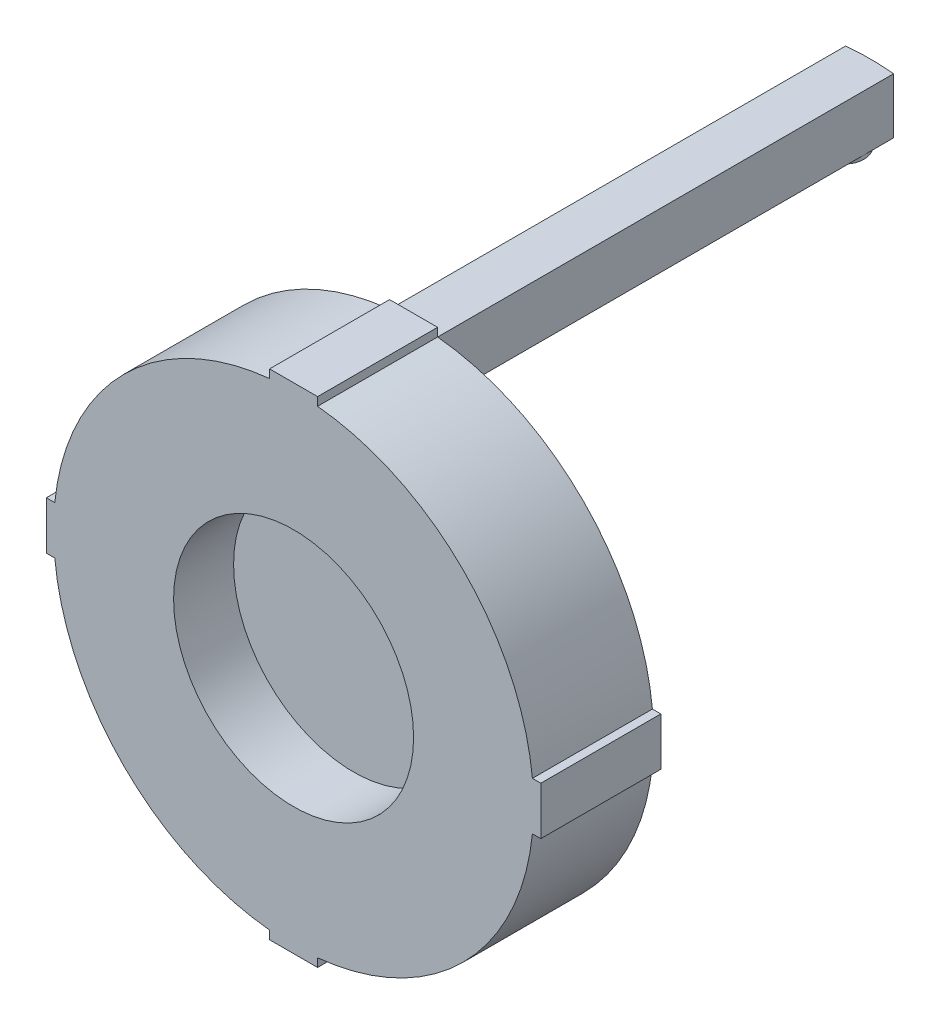
ISO-10303-21;
HEADER;
FILE_DESCRIPTION(('STEP AP214'),'2;1');
FILE_NAME('part.step','',(''),(''),'','','');
FILE_SCHEMA(('AUTOMOTIVE_DESIGN { 1 0 10303 214 1 1 1 1 }'));
ENDSEC;
DATA;
#1=APPLICATION_CONTEXT('core data for automotive mechanical design processes');
#2=APPLICATION_PROTOCOL_DEFINITION('international standard','automotive_design',2000,#1);
#3=PRODUCT_CONTEXT('',#1,'mechanical');
#4=PRODUCT('Part','Part','',(#3));
#5=PRODUCT_RELATED_PRODUCT_CATEGORY('part','',(#4));
#6=PRODUCT_DEFINITION_FORMATION('','',#4);
#7=PRODUCT_DEFINITION_CONTEXT('part definition',#1,'design');
#8=PRODUCT_DEFINITION('design','',#6,#7);
#9=PRODUCT_DEFINITION_SHAPE('','',#8);
#10=(LENGTH_UNIT() NAMED_UNIT(*) SI_UNIT(.MILLI.,.METRE.));
#11=(NAMED_UNIT(*) PLANE_ANGLE_UNIT() SI_UNIT($,.RADIAN.));
#12=(NAMED_UNIT(*) SI_UNIT($,.STERADIAN.) SOLID_ANGLE_UNIT());
#13=UNCERTAINTY_MEASURE_WITH_UNIT(LENGTH_MEASURE(1.E-05),#10,'distance_accuracy_value','');
#14=(GEOMETRIC_REPRESENTATION_CONTEXT(3) GLOBAL_UNCERTAINTY_ASSIGNED_CONTEXT((#13)) GLOBAL_UNIT_ASSIGNED_CONTEXT((#10,
#11,#12)) REPRESENTATION_CONTEXT('',''));
#15=CARTESIAN_POINT('',(0.,0.,0.));
#16=DIRECTION('',(0.,0.,1.));
#17=DIRECTION('',(1.,0.,0.));
#18=AXIS2_PLACEMENT_3D('',#15,#16,#17);
#19=CARTESIAN_POINT('',(0.500000000000018,5.15,0.));
#20=DIRECTION('',(1.,0.,0.));
#21=DIRECTION('',(0.,1.,0.));
#22=AXIS2_PLACEMENT_3D('',#19,#20,#21);
#23=PLANE('',#22);
#24=DIRECTION('',(0.,0.,-1.));
#25=VECTOR('',#24,1.);
#26=CARTESIAN_POINT('',(0.500000000000017,4.9749371855331,2.5));
#27=LINE('',#26,#25);
#28=CARTESIAN_POINT('',(0.500000000000017,4.9749371855331,0.));
#29=VERTEX_POINT('',#28);
#30=CARTESIAN_POINT('',(0.500000000000017,4.9749371855331,2.5));
#31=VERTEX_POINT('',#30);
#32=EDGE_CURVE('E217',#29,#31,#27,.F.);
#33=ORIENTED_EDGE('',*,*,#32,.F.);
#34=DIRECTION('',(0.,1.,0.));
#35=VECTOR('',#34,1.);
#36=CARTESIAN_POINT('',(0.500000000000018,5.15,0.));
#37=LINE('',#36,#35);
#38=CARTESIAN_POINT('',(0.500000000000018,5.15,0.));
#39=VERTEX_POINT('',#38);
#40=EDGE_CURVE('E186',#29,#39,#37,.T.);
#41=ORIENTED_EDGE('',*,*,#40,.T.);
#42=DIRECTION('',(0.,0.,1.));
#43=VECTOR('',#42,1.);
#44=CARTESIAN_POINT('',(0.500000000000018,5.15,0.));
#45=LINE('',#44,#43);
#46=CARTESIAN_POINT('',(0.500000000000018,5.15,2.5));
#47=VERTEX_POINT('',#46);
#48=EDGE_CURVE('E218',#39,#47,#45,.T.);
#49=ORIENTED_EDGE('',*,*,#48,.T.);
#50=DIRECTION('',(0.,1.,0.));
#51=VECTOR('',#50,1.);
#52=CARTESIAN_POINT('',(0.500000000000018,5.15,2.5));
#53=LINE('',#52,#51);
#54=EDGE_CURVE('E306',#31,#47,#53,.T.);
#55=ORIENTED_EDGE('',*,*,#54,.F.);
#56=EDGE_LOOP('',(#33,#41,#49,#55));
#57=FACE_BOUND('',#56,.T.);
#58=ADVANCED_FACE('F39',(#57),#23,.T.);
#59=CARTESIAN_POINT('',(-0.499999999999982,5.15,0.));
#60=DIRECTION('',(-1.,0.,0.));
#61=DIRECTION('',(0.,-1.,0.));
#62=AXIS2_PLACEMENT_3D('',#59,#60,#61);
#63=PLANE('',#62);
#64=DIRECTION('',(0.,0.,1.));
#65=VECTOR('',#64,1.);
#66=CARTESIAN_POINT('',(-0.499999999999982,5.15,0.));
#67=LINE('',#66,#65);
#68=CARTESIAN_POINT('',(-0.499999999999982,5.15,0.));
#69=VERTEX_POINT('',#68);
#70=CARTESIAN_POINT('',(-0.499999999999982,5.15,2.5));
#71=VERTEX_POINT('',#70);
#72=EDGE_CURVE('E197',#69,#71,#67,.T.);
#73=ORIENTED_EDGE('',*,*,#72,.F.);
#74=DIRECTION('',(0.,-1.,0.));
#75=VECTOR('',#74,1.);
#76=CARTESIAN_POINT('',(-0.499999999999982,5.15,0.));
#77=LINE('',#76,#75);
#78=CARTESIAN_POINT('',(-0.499999999999983,4.9749371855331,0.));
#79=VERTEX_POINT('',#78);
#80=EDGE_CURVE('E183',#69,#79,#77,.T.);
#81=ORIENTED_EDGE('',*,*,#80,.T.);
#82=DIRECTION('',(0.,0.,-1.));
#83=VECTOR('',#82,1.);
#84=CARTESIAN_POINT('',(-0.499999999999983,4.9749371855331,2.5));
#85=LINE('',#84,#83);
#86=CARTESIAN_POINT('',(-0.499999999999983,4.9749371855331,2.5));
#87=VERTEX_POINT('',#86);
#88=EDGE_CURVE('E195',#87,#79,#85,.T.);
#89=ORIENTED_EDGE('',*,*,#88,.F.);
#90=DIRECTION('',(0.,-1.,0.));
#91=VECTOR('',#90,1.);
#92=CARTESIAN_POINT('',(-0.499999999999982,5.15,2.5));
#93=LINE('',#92,#91);
#94=EDGE_CURVE('E303',#71,#87,#93,.T.);
#95=ORIENTED_EDGE('',*,*,#94,.F.);
#96=EDGE_LOOP('',(#73,#81,#89,#95));
#97=FACE_BOUND('',#96,.T.);
#98=ADVANCED_FACE('F192',(#97),#63,.T.);
#99=CARTESIAN_POINT('',(0.500000000000018,5.15,0.));
#100=DIRECTION('',(0.,1.,0.));
#101=DIRECTION('',(-1.,0.,0.));
#102=AXIS2_PLACEMENT_3D('',#99,#100,#101);
#103=PLANE('',#102);
#104=ORIENTED_EDGE('',*,*,#48,.F.);
#105=DIRECTION('',(-1.,0.,0.));
#106=VECTOR('',#105,1.);
#107=CARTESIAN_POINT('',(0.500000000000018,5.15,0.));
#108=LINE('',#107,#106);
#109=EDGE_CURVE('E199',#39,#69,#108,.T.);
#110=ORIENTED_EDGE('',*,*,#109,.T.);
#111=ORIENTED_EDGE('',*,*,#72,.T.);
#112=DIRECTION('',(-1.,0.,0.));
#113=VECTOR('',#112,1.);
#114=CARTESIAN_POINT('',(0.500000000000018,5.15,2.5));
#115=LINE('',#114,#113);
#116=EDGE_CURVE('E267',#47,#71,#115,.T.);
#117=ORIENTED_EDGE('',*,*,#116,.F.);
#118=EDGE_LOOP('',(#104,#110,#111,#117));
#119=FACE_BOUND('',#118,.T.);
#120=ADVANCED_FACE('F452',(#119),#103,.T.);
#121=CARTESIAN_POINT('',(0.,0.,-9.5));
#122=DIRECTION('',(0.,0.,-1.));
#123=DIRECTION('',(-1.,0.,0.));
#124=AXIS2_PLACEMENT_3D('',#121,#122,#123);
#125=PLANE('',#124);
#126=CARTESIAN_POINT('',(0.,0.,-9.5));
#127=DIRECTION('',(0.,0.,-1.));
#128=DIRECTION('',(-1.,0.,0.));
#129=AXIS2_PLACEMENT_3D('',#126,#127,#128);
#130=CIRCLE('',#129,5.);
#131=CARTESIAN_POINT('',(0.500000000000017,4.9749371855331,-9.5));
#132=VERTEX_POINT('',#131);
#133=CARTESIAN_POINT('',(-0.499999999999982,4.9749371855331,-9.5));
#134=VERTEX_POINT('',#133);
#135=EDGE_CURVE('E11',#132,#134,#130,.F.);
#136=ORIENTED_EDGE('',*,*,#135,.F.);
#137=DIRECTION('',(0.,-1.,0.));
#138=VECTOR('',#137,1.);
#139=CARTESIAN_POINT('',(0.500000000000017,5.15,-9.5));
#140=LINE('',#139,#138);
#141=CARTESIAN_POINT('',(0.500000000000017,3.81739439932528,-9.5));
#142=VERTEX_POINT('',#141);
#143=EDGE_CURVE('E208',#132,#142,#140,.T.);
#144=ORIENTED_EDGE('',*,*,#143,.T.);
#145=CARTESIAN_POINT('',(0.,0.,-9.5));
#146=DIRECTION('',(0.,0.,-1.));
#147=DIRECTION('',(-1.,0.,0.));
#148=AXIS2_PLACEMENT_3D('',#145,#146,#147);
#149=CIRCLE('',#148,3.85);
#150=CARTESIAN_POINT('',(-0.499999999999982,3.81739439932528,-9.5));
#151=VERTEX_POINT('',#150);
#152=EDGE_CURVE('E353',#142,#151,#149,.F.);
#153=ORIENTED_EDGE('',*,*,#152,.T.);
#154=DIRECTION('',(0.,1.,0.));
#155=VECTOR('',#154,1.);
#156=CARTESIAN_POINT('',(-0.499999999999982,5.15,-9.5));
#157=LINE('',#156,#155);
#158=EDGE_CURVE('E390',#151,#134,#157,.T.);
#159=ORIENTED_EDGE('',*,*,#158,.T.);
#160=EDGE_LOOP('',(#136,#144,#153,#159));
#161=FACE_BOUND('',#160,.T.);
#162=ADVANCED_FACE('F455',(#161),#125,.T.);
#163=DIRECTION('',(0.,0.,1.));
#164=VECTOR('',#163,1.);
#165=CARTESIAN_POINT('',(0.500000000000017,4.9749371855331,-17.));
#166=LINE('',#165,#164);
#167=EDGE_CURVE('E54',#29,#132,#166,.F.);
#168=ORIENTED_EDGE('',*,*,#167,.F.);
#169=DIRECTION('',(0.,-1.,0.));
#170=VECTOR('',#169,1.);
#171=CARTESIAN_POINT('',(0.500000000000017,5.15,0.));
#172=LINE('',#171,#170);
#173=CARTESIAN_POINT('',(0.500000000000013,3.81739439932528,0.));
#174=VERTEX_POINT('',#173);
#175=EDGE_CURVE('E346',#29,#174,#172,.T.);
#176=ORIENTED_EDGE('',*,*,#175,.T.);
#177=DIRECTION('',(0.,0.,1.));
#178=VECTOR('',#177,1.);
#179=CARTESIAN_POINT('',(0.500000000000013,3.81739439932528,-14.));
#180=LINE('',#179,#178);
#181=EDGE_CURVE('E209',#174,#142,#180,.F.);
#182=ORIENTED_EDGE('',*,*,#181,.T.);
#183=ORIENTED_EDGE('',*,*,#143,.F.);
#184=EDGE_LOOP('',(#168,#176,#182,#183));
#185=FACE_BOUND('',#184,.T.);
#186=ADVANCED_FACE('F372',(#185),#23,.T.);
#187=DIRECTION('',(0.,0.,1.));
#188=VECTOR('',#187,1.);
#189=CARTESIAN_POINT('',(-0.499999999999983,4.9749371855331,-17.));
#190=LINE('',#189,#188);
#191=EDGE_CURVE('E170',#134,#79,#190,.T.);
#192=ORIENTED_EDGE('',*,*,#191,.F.);
#193=ORIENTED_EDGE('',*,*,#158,.F.);
#194=DIRECTION('',(0.,0.,1.));
#195=VECTOR('',#194,1.);
#196=CARTESIAN_POINT('',(-0.499999999999987,3.81739439932528,-14.));
#197=LINE('',#196,#195);
#198=CARTESIAN_POINT('',(-0.499999999999987,3.81739439932528,0.));
#199=VERTEX_POINT('',#198);
#200=EDGE_CURVE('E62',#151,#199,#197,.T.);
#201=ORIENTED_EDGE('',*,*,#200,.T.);
#202=DIRECTION('',(0.,1.,0.));
#203=VECTOR('',#202,1.);
#204=CARTESIAN_POINT('',(-0.499999999999982,5.15,0.));
#205=LINE('',#204,#203);
#206=EDGE_CURVE('E202',#199,#79,#205,.T.);
#207=ORIENTED_EDGE('',*,*,#206,.T.);
#208=EDGE_LOOP('',(#192,#193,#201,#207));
#209=FACE_BOUND('',#208,.T.);
#210=ADVANCED_FACE('F203',(#209),#63,.T.);
#211=CARTESIAN_POINT('',(0.,0.,0.));
#212=DIRECTION('',(0.,0.,1.));
#213=DIRECTION('',(1.,0.,0.));
#214=AXIS2_PLACEMENT_3D('',#211,#212,#213);
#215=PLANE('',#214);
#216=DIRECTION('',(1.,0.,0.));
#217=VECTOR('',#216,1.);
#218=CARTESIAN_POINT('',(5.15,-0.5,0.));
#219=LINE('',#218,#217);
#220=CARTESIAN_POINT('',(4.9749371855331,-0.5,0.));
#221=VERTEX_POINT('',#220);
#222=CARTESIAN_POINT('',(5.15,-0.5,0.));
#223=VERTEX_POINT('',#222);
#224=EDGE_CURVE('E263',#221,#223,#219,.T.);
#225=ORIENTED_EDGE('',*,*,#224,.F.);
#226=CARTESIAN_POINT('',(0.,0.,0.));
#227=DIRECTION('',(0.,0.,1.));
#228=DIRECTION('',(1.,0.,0.));
#229=AXIS2_PLACEMENT_3D('',#226,#227,#228);
#230=CIRCLE('',#229,5.);
#231=CARTESIAN_POINT('',(0.499999999999948,-4.9749371855331,0.));
#232=VERTEX_POINT('',#231);
#233=EDGE_CURVE('E233',#232,#221,#230,.T.);
#234=ORIENTED_EDGE('',*,*,#233,.F.);
#235=DIRECTION('',(0.,1.,0.));
#236=VECTOR('',#235,1.);
#237=CARTESIAN_POINT('',(0.499999999999946,-5.15000000000001,0.));
#238=LINE('',#237,#236);
#239=CARTESIAN_POINT('',(0.499999999999946,-5.15000000000001,0.));
#240=VERTEX_POINT('',#239);
#241=EDGE_CURVE('E406',#240,#232,#238,.T.);
#242=ORIENTED_EDGE('',*,*,#241,.F.);
#243=DIRECTION('',(1.,0.,0.));
#244=VECTOR('',#243,1.);
#245=CARTESIAN_POINT('',(-0.500000000000054,-5.15,0.));
#246=LINE('',#245,#244);
#247=CARTESIAN_POINT('',(-0.500000000000054,-5.15,0.));
#248=VERTEX_POINT('',#247);
#249=EDGE_CURVE('E402',#248,#240,#246,.T.);
#250=ORIENTED_EDGE('',*,*,#249,.F.);
#251=DIRECTION('',(0.,-1.,0.));
#252=VECTOR('',#251,1.);
#253=CARTESIAN_POINT('',(-0.500000000000054,-5.15,0.));
#254=LINE('',#253,#252);
#255=CARTESIAN_POINT('',(-0.500000000000052,-4.97493718553309,0.));
#256=VERTEX_POINT('',#255);
#257=EDGE_CURVE('E410',#256,#248,#254,.T.);
#258=ORIENTED_EDGE('',*,*,#257,.F.);
#259=CARTESIAN_POINT('',(-4.9749371855331,-0.5,0.));
#260=VERTEX_POINT('',#259);
#261=EDGE_CURVE('E229',#260,#256,#230,.T.);
#262=ORIENTED_EDGE('',*,*,#261,.F.);
#263=DIRECTION('',(1.,0.,0.));
#264=VECTOR('',#263,1.);
#265=CARTESIAN_POINT('',(-5.15,-0.5,0.));
#266=LINE('',#265,#264);
#267=CARTESIAN_POINT('',(-5.15,-0.5,0.));
#268=VERTEX_POINT('',#267);
#269=EDGE_CURVE('E322',#268,#260,#266,.T.);
#270=ORIENTED_EDGE('',*,*,#269,.F.);
#271=DIRECTION('',(0.,-1.,0.));
#272=VECTOR('',#271,1.);
#273=CARTESIAN_POINT('',(-5.15,0.5,0.));
#274=LINE('',#273,#272);
#275=CARTESIAN_POINT('',(-5.15,0.5,0.));
#276=VERTEX_POINT('',#275);
#277=EDGE_CURVE('E318',#276,#268,#274,.T.);
#278=ORIENTED_EDGE('',*,*,#277,.F.);
#279=DIRECTION('',(-1.,0.,0.));
#280=VECTOR('',#279,1.);
#281=CARTESIAN_POINT('',(-5.15,0.5,0.));
#282=LINE('',#281,#280);
#283=CARTESIAN_POINT('',(-4.9749371855331,0.5,0.));
#284=VERTEX_POINT('',#283);
#285=EDGE_CURVE('E224',#284,#276,#282,.T.);
#286=ORIENTED_EDGE('',*,*,#285,.F.);
#287=EDGE_CURVE('E213',#79,#284,#230,.T.);
#288=ORIENTED_EDGE('',*,*,#287,.F.);
#289=ORIENTED_EDGE('',*,*,#206,.F.);
#290=CARTESIAN_POINT('',(0.,0.,0.));
#291=DIRECTION('',(0.,0.,-1.));
#292=DIRECTION('',(-1.,0.,0.));
#293=AXIS2_PLACEMENT_3D('',#290,#291,#292);
#294=CIRCLE('',#293,3.85);
#295=EDGE_CURVE('E369',#199,#174,#294,.T.);
#296=ORIENTED_EDGE('',*,*,#295,.T.);
#297=ORIENTED_EDGE('',*,*,#175,.F.);
#298=CARTESIAN_POINT('',(4.9749371855331,0.5,0.));
#299=VERTEX_POINT('',#298);
#300=EDGE_CURVE('E226',#299,#29,#230,.T.);
#301=ORIENTED_EDGE('',*,*,#300,.F.);
#302=DIRECTION('',(-1.,0.,0.));
#303=VECTOR('',#302,1.);
#304=CARTESIAN_POINT('',(5.15,0.5,0.));
#305=LINE('',#304,#303);
#306=CARTESIAN_POINT('',(5.15,0.5,0.));
#307=VERTEX_POINT('',#306);
#308=EDGE_CURVE('E276',#307,#299,#305,.T.);
#309=ORIENTED_EDGE('',*,*,#308,.F.);
#310=DIRECTION('',(0.,1.,0.));
#311=VECTOR('',#310,1.);
#312=CARTESIAN_POINT('',(5.15,-0.5,0.));
#313=LINE('',#312,#311);
#314=EDGE_CURVE('E273',#223,#307,#313,.T.);
#315=ORIENTED_EDGE('',*,*,#314,.F.);
#316=EDGE_LOOP('',(#225,#234,#242,#250,#258,#262,#270,#278,#286,#288,#289,#296,#297,#301,#309,#315));
#317=FACE_BOUND('',#316,.T.);
#318=ADVANCED_FACE('F222',(#317),#215,.F.);
#319=CARTESIAN_POINT('',(0.,0.,2.5));
#320=DIRECTION('',(0.,0.,-1.));
#321=DIRECTION('',(-1.,0.,0.));
#322=AXIS2_PLACEMENT_3D('',#319,#320,#321);
#323=CYLINDRICAL_SURFACE('',#322,5.);
#324=ORIENTED_EDGE('',*,*,#261,.T.);
#325=DIRECTION('',(0.,0.,-1.));
#326=VECTOR('',#325,1.);
#327=CARTESIAN_POINT('',(-0.500000000000052,-4.97493718553309,2.5));
#328=LINE('',#327,#326);
#329=CARTESIAN_POINT('',(-0.500000000000052,-4.97493718553309,2.5));
#330=VERTEX_POINT('',#329);
#331=EDGE_CURVE('E290',#256,#330,#328,.F.);
#332=ORIENTED_EDGE('',*,*,#331,.T.);
#333=CARTESIAN_POINT('',(0.,0.,2.5));
#334=DIRECTION('',(0.,0.,1.));
#335=DIRECTION('',(1.,0.,0.));
#336=AXIS2_PLACEMENT_3D('',#333,#334,#335);
#337=CIRCLE('',#336,5.);
#338=CARTESIAN_POINT('',(-4.9749371855331,-0.5,2.5));
#339=VERTEX_POINT('',#338);
#340=EDGE_CURVE('E247',#339,#330,#337,.T.);
#341=ORIENTED_EDGE('',*,*,#340,.F.);
#342=DIRECTION('',(0.,0.,-1.));
#343=VECTOR('',#342,1.);
#344=CARTESIAN_POINT('',(-4.9749371855331,-0.5,2.5));
#345=LINE('',#344,#343);
#346=EDGE_CURVE('E234',#339,#260,#345,.T.);
#347=ORIENTED_EDGE('',*,*,#346,.T.);
#348=EDGE_LOOP('',(#324,#332,#341,#347));
#349=FACE_BOUND('',#348,.T.);
#350=ADVANCED_FACE('F508',(#349),#323,.T.);
#351=CARTESIAN_POINT('',(0.499999999999948,-4.9749371855331,2.5));
#352=VERTEX_POINT('',#351);
#353=CARTESIAN_POINT('',(4.9749371855331,-0.5,2.5));
#354=VERTEX_POINT('',#353);
#355=EDGE_CURVE('E347',#352,#354,#337,.T.);
#356=ORIENTED_EDGE('',*,*,#355,.F.);
#357=DIRECTION('',(0.,0.,-1.));
#358=VECTOR('',#357,1.);
#359=CARTESIAN_POINT('',(0.499999999999948,-4.9749371855331,2.5));
#360=LINE('',#359,#358);
#361=EDGE_CURVE('E257',#352,#232,#360,.T.);
#362=ORIENTED_EDGE('',*,*,#361,.T.);
#363=ORIENTED_EDGE('',*,*,#233,.T.);
#364=DIRECTION('',(0.,0.,-1.));
#365=VECTOR('',#364,1.);
#366=CARTESIAN_POINT('',(4.9749371855331,-0.5,2.5));
#367=LINE('',#366,#365);
#368=EDGE_CURVE('E255',#221,#354,#367,.F.);
#369=ORIENTED_EDGE('',*,*,#368,.T.);
#370=EDGE_LOOP('',(#356,#362,#363,#369));
#371=FACE_BOUND('',#370,.T.);
#372=ADVANCED_FACE('F254',(#371),#323,.T.);
#373=CARTESIAN_POINT('',(4.9749371855331,0.5,2.5));
#374=VERTEX_POINT('',#373);
#375=EDGE_CURVE('E246',#374,#31,#337,.T.);
#376=ORIENTED_EDGE('',*,*,#375,.F.);
#377=DIRECTION('',(0.,0.,-1.));
#378=VECTOR('',#377,1.);
#379=CARTESIAN_POINT('',(4.9749371855331,0.5,2.5));
#380=LINE('',#379,#378);
#381=EDGE_CURVE('E268',#374,#299,#380,.T.);
#382=ORIENTED_EDGE('',*,*,#381,.T.);
#383=ORIENTED_EDGE('',*,*,#300,.T.);
#384=ORIENTED_EDGE('',*,*,#32,.T.);
#385=EDGE_LOOP('',(#376,#382,#383,#384));
#386=FACE_BOUND('',#385,.T.);
#387=ADVANCED_FACE('F366',(#386),#323,.T.);
#388=CARTESIAN_POINT('',(-4.9749371855331,0.5,2.5));
#389=VERTEX_POINT('',#388);
#390=EDGE_CURVE('E215',#87,#389,#337,.T.);
#391=ORIENTED_EDGE('',*,*,#390,.F.);
#392=ORIENTED_EDGE('',*,*,#88,.T.);
#393=ORIENTED_EDGE('',*,*,#287,.T.);
#394=DIRECTION('',(0.,0.,-1.));
#395=VECTOR('',#394,1.);
#396=CARTESIAN_POINT('',(-4.9749371855331,0.5,2.5));
#397=LINE('',#396,#395);
#398=EDGE_CURVE('E227',#284,#389,#397,.F.);
#399=ORIENTED_EDGE('',*,*,#398,.T.);
#400=EDGE_LOOP('',(#391,#392,#393,#399));
#401=FACE_BOUND('',#400,.T.);
#402=ADVANCED_FACE('F41',(#401),#323,.T.);
#403=CARTESIAN_POINT('',(0.,0.,2.5));
#404=DIRECTION('',(0.,0.,1.));
#405=DIRECTION('',(1.,0.,0.));
#406=AXIS2_PLACEMENT_3D('',#403,#404,#405);
#407=PLANE('',#406);
#408=CARTESIAN_POINT('',(0.,0.,2.5));
#409=DIRECTION('',(0.,0.,1.));
#410=DIRECTION('',(1.,0.,0.));
#411=AXIS2_PLACEMENT_3D('',#408,#409,#410);
#412=CIRCLE('',#411,2.5);
#413=CARTESIAN_POINT('',(2.5,0.,2.5));
#414=VERTEX_POINT('',#413);
#415=EDGE_CURVE('E392',#414,#414,#412,.T.);
#416=ORIENTED_EDGE('',*,*,#415,.F.);
#417=EDGE_LOOP('',(#416));
#418=FACE_BOUND('',#417,.T.);
#419=ORIENTED_EDGE('',*,*,#340,.T.);
#420=DIRECTION('',(0.,-1.,0.));
#421=VECTOR('',#420,1.);
#422=CARTESIAN_POINT('',(-0.500000000000054,-5.15,2.5));
#423=LINE('',#422,#421);
#424=CARTESIAN_POINT('',(-0.500000000000054,-5.15,2.5));
#425=VERTEX_POINT('',#424);
#426=EDGE_CURVE('E407',#330,#425,#423,.T.);
#427=ORIENTED_EDGE('',*,*,#426,.T.);
#428=DIRECTION('',(1.,0.,0.));
#429=VECTOR('',#428,1.);
#430=CARTESIAN_POINT('',(-0.500000000000054,-5.15,2.5));
#431=LINE('',#430,#429);
#432=CARTESIAN_POINT('',(0.499999999999946,-5.15000000000001,2.5));
#433=VERTEX_POINT('',#432);
#434=EDGE_CURVE('E398',#425,#433,#431,.T.);
#435=ORIENTED_EDGE('',*,*,#434,.T.);
#436=DIRECTION('',(0.,1.,0.));
#437=VECTOR('',#436,1.);
#438=CARTESIAN_POINT('',(0.499999999999946,-5.15000000000001,2.5));
#439=LINE('',#438,#437);
#440=EDGE_CURVE('E417',#433,#352,#439,.T.);
#441=ORIENTED_EDGE('',*,*,#440,.T.);
#442=ORIENTED_EDGE('',*,*,#355,.T.);
#443=DIRECTION('',(1.,0.,0.));
#444=VECTOR('',#443,1.);
#445=CARTESIAN_POINT('',(5.15,-0.5,2.5));
#446=LINE('',#445,#444);
#447=CARTESIAN_POINT('',(5.15,-0.5,2.5));
#448=VERTEX_POINT('',#447);
#449=EDGE_CURVE('E265',#354,#448,#446,.T.);
#450=ORIENTED_EDGE('',*,*,#449,.T.);
#451=DIRECTION('',(0.,1.,0.));
#452=VECTOR('',#451,1.);
#453=CARTESIAN_POINT('',(5.15,-0.5,2.5));
#454=LINE('',#453,#452);
#455=CARTESIAN_POINT('',(5.15,0.5,2.5));
#456=VERTEX_POINT('',#455);
#457=EDGE_CURVE('E285',#448,#456,#454,.T.);
#458=ORIENTED_EDGE('',*,*,#457,.T.);
#459=DIRECTION('',(-1.,0.,0.));
#460=VECTOR('',#459,1.);
#461=CARTESIAN_POINT('',(5.15,0.5,2.5));
#462=LINE('',#461,#460);
#463=EDGE_CURVE('E289',#456,#374,#462,.T.);
#464=ORIENTED_EDGE('',*,*,#463,.T.);
#465=ORIENTED_EDGE('',*,*,#375,.T.);
#466=ORIENTED_EDGE('',*,*,#54,.T.);
#467=ORIENTED_EDGE('',*,*,#116,.T.);
#468=ORIENTED_EDGE('',*,*,#94,.T.);
#469=ORIENTED_EDGE('',*,*,#390,.T.);
#470=DIRECTION('',(-1.,0.,0.));
#471=VECTOR('',#470,1.);
#472=CARTESIAN_POINT('',(-5.15,0.5,2.5));
#473=LINE('',#472,#471);
#474=CARTESIAN_POINT('',(-5.15,0.5,2.5));
#475=VERTEX_POINT('',#474);
#476=EDGE_CURVE('E323',#389,#475,#473,.T.);
#477=ORIENTED_EDGE('',*,*,#476,.T.);
#478=DIRECTION('',(0.,-1.,0.));
#479=VECTOR('',#478,1.);
#480=CARTESIAN_POINT('',(-5.15,0.5,2.5));
#481=LINE('',#480,#479);
#482=CARTESIAN_POINT('',(-5.15,-0.5,2.5));
#483=VERTEX_POINT('',#482);
#484=EDGE_CURVE('E317',#475,#483,#481,.T.);
#485=ORIENTED_EDGE('',*,*,#484,.T.);
#486=DIRECTION('',(1.,0.,0.));
#487=VECTOR('',#486,1.);
#488=CARTESIAN_POINT('',(-5.15,-0.5,2.5));
#489=LINE('',#488,#487);
#490=EDGE_CURVE('E332',#483,#339,#489,.T.);
#491=ORIENTED_EDGE('',*,*,#490,.T.);
#492=EDGE_LOOP('',(#419,#427,#435,#441,#442,#450,#458,#464,#465,#466,#467,#468,#469,#477,#485,#491));
#493=FACE_BOUND('',#492,.T.);
#494=ADVANCED_FACE('F358',(#418,#493),#407,.T.);
#495=CARTESIAN_POINT('',(-5.15,0.5,0.));
#496=DIRECTION('',(0.,1.,0.));
#497=DIRECTION('',(0.,0.,1.));
#498=AXIS2_PLACEMENT_3D('',#495,#496,#497);
#499=PLANE('',#498);
#500=ORIENTED_EDGE('',*,*,#398,.F.);
#501=ORIENTED_EDGE('',*,*,#285,.T.);
#502=DIRECTION('',(0.,0.,1.));
#503=VECTOR('',#502,1.);
#504=CARTESIAN_POINT('',(-5.15,0.5,0.));
#505=LINE('',#504,#503);
#506=EDGE_CURVE('E337',#276,#475,#505,.T.);
#507=ORIENTED_EDGE('',*,*,#506,.T.);
#508=ORIENTED_EDGE('',*,*,#476,.F.);
#509=EDGE_LOOP('',(#500,#501,#507,#508));
#510=FACE_BOUND('',#509,.T.);
#511=ADVANCED_FACE('F506',(#510),#499,.T.);
#512=CARTESIAN_POINT('',(-5.15,-0.5,0.));
#513=DIRECTION('',(0.,-1.,0.));
#514=DIRECTION('',(0.,0.,-1.));
#515=AXIS2_PLACEMENT_3D('',#512,#513,#514);
#516=PLANE('',#515);
#517=ORIENTED_EDGE('',*,*,#346,.F.);
#518=ORIENTED_EDGE('',*,*,#490,.F.);
#519=DIRECTION('',(0.,0.,1.));
#520=VECTOR('',#519,1.);
#521=CARTESIAN_POINT('',(-5.15,-0.5,0.));
#522=LINE('',#521,#520);
#523=EDGE_CURVE('E328',#268,#483,#522,.T.);
#524=ORIENTED_EDGE('',*,*,#523,.F.);
#525=ORIENTED_EDGE('',*,*,#269,.T.);
#526=EDGE_LOOP('',(#517,#518,#524,#525));
#527=FACE_BOUND('',#526,.T.);
#528=ADVANCED_FACE('F507',(#527),#516,.T.);
#529=CARTESIAN_POINT('',(-5.15,0.5,0.));
#530=DIRECTION('',(-1.,0.,0.));
#531=DIRECTION('',(0.,0.,1.));
#532=AXIS2_PLACEMENT_3D('',#529,#530,#531);
#533=PLANE('',#532);
#534=ORIENTED_EDGE('',*,*,#484,.F.);
#535=ORIENTED_EDGE('',*,*,#506,.F.);
#536=ORIENTED_EDGE('',*,*,#277,.T.);
#537=ORIENTED_EDGE('',*,*,#523,.T.);
#538=EDGE_LOOP('',(#534,#535,#536,#537));
#539=FACE_BOUND('',#538,.T.);
#540=ADVANCED_FACE('F445',(#539),#533,.T.);
#541=CARTESIAN_POINT('',(5.15,-0.5,0.));
#542=DIRECTION('',(0.,-1.,0.));
#543=DIRECTION('',(0.,0.,-1.));
#544=AXIS2_PLACEMENT_3D('',#541,#542,#543);
#545=PLANE('',#544);
#546=ORIENTED_EDGE('',*,*,#368,.F.);
#547=ORIENTED_EDGE('',*,*,#224,.T.);
#548=DIRECTION('',(0.,0.,1.));
#549=VECTOR('',#548,1.);
#550=CARTESIAN_POINT('',(5.15,-0.5,0.));
#551=LINE('',#550,#549);
#552=EDGE_CURVE('E280',#223,#448,#551,.T.);
#553=ORIENTED_EDGE('',*,*,#552,.T.);
#554=ORIENTED_EDGE('',*,*,#449,.F.);
#555=EDGE_LOOP('',(#546,#547,#553,#554));
#556=FACE_BOUND('',#555,.T.);
#557=ADVANCED_FACE('F261',(#556),#545,.T.);
#558=CARTESIAN_POINT('',(5.15,0.5,0.));
#559=DIRECTION('',(0.,1.,0.));
#560=DIRECTION('',(0.,0.,1.));
#561=AXIS2_PLACEMENT_3D('',#558,#559,#560);
#562=PLANE('',#561);
#563=ORIENTED_EDGE('',*,*,#381,.F.);
#564=ORIENTED_EDGE('',*,*,#463,.F.);
#565=DIRECTION('',(0.,0.,1.));
#566=VECTOR('',#565,1.);
#567=CARTESIAN_POINT('',(5.15,0.5,0.));
#568=LINE('',#567,#566);
#569=EDGE_CURVE('E275',#307,#456,#568,.T.);
#570=ORIENTED_EDGE('',*,*,#569,.F.);
#571=ORIENTED_EDGE('',*,*,#308,.T.);
#572=EDGE_LOOP('',(#563,#564,#570,#571));
#573=FACE_BOUND('',#572,.T.);
#574=ADVANCED_FACE('F436',(#573),#562,.T.);
#575=CARTESIAN_POINT('',(5.15,-0.5,0.));
#576=DIRECTION('',(1.,0.,0.));
#577=DIRECTION('',(0.,0.,-1.));
#578=AXIS2_PLACEMENT_3D('',#575,#576,#577);
#579=PLANE('',#578);
#580=ORIENTED_EDGE('',*,*,#457,.F.);
#581=ORIENTED_EDGE('',*,*,#552,.F.);
#582=ORIENTED_EDGE('',*,*,#314,.T.);
#583=ORIENTED_EDGE('',*,*,#569,.T.);
#584=EDGE_LOOP('',(#580,#581,#582,#583));
#585=FACE_BOUND('',#584,.T.);
#586=ADVANCED_FACE('F434',(#585),#579,.T.);
#587=CARTESIAN_POINT('',(-0.500000000000054,-5.15,0.));
#588=DIRECTION('',(-1.,0.,0.));
#589=DIRECTION('',(0.,-1.,0.));
#590=AXIS2_PLACEMENT_3D('',#587,#588,#589);
#591=PLANE('',#590);
#592=ORIENTED_EDGE('',*,*,#331,.F.);
#593=ORIENTED_EDGE('',*,*,#257,.T.);
#594=DIRECTION('',(0.,0.,1.));
#595=VECTOR('',#594,1.);
#596=CARTESIAN_POINT('',(-0.500000000000054,-5.15,0.));
#597=LINE('',#596,#595);
#598=EDGE_CURVE('E422',#248,#425,#597,.T.);
#599=ORIENTED_EDGE('',*,*,#598,.T.);
#600=ORIENTED_EDGE('',*,*,#426,.F.);
#601=EDGE_LOOP('',(#592,#593,#599,#600));
#602=FACE_BOUND('',#601,.T.);
#603=ADVANCED_FACE('F443',(#602),#591,.T.);
#604=CARTESIAN_POINT('',(0.499999999999946,-5.15000000000001,0.));
#605=DIRECTION('',(1.,0.,0.));
#606=DIRECTION('',(0.,1.,0.));
#607=AXIS2_PLACEMENT_3D('',#604,#605,#606);
#608=PLANE('',#607);
#609=ORIENTED_EDGE('',*,*,#361,.F.);
#610=ORIENTED_EDGE('',*,*,#440,.F.);
#611=DIRECTION('',(0.,0.,1.));
#612=VECTOR('',#611,1.);
#613=CARTESIAN_POINT('',(0.499999999999946,-5.15000000000001,0.));
#614=LINE('',#613,#612);
#615=EDGE_CURVE('E413',#240,#433,#614,.T.);
#616=ORIENTED_EDGE('',*,*,#615,.F.);
#617=ORIENTED_EDGE('',*,*,#241,.T.);
#618=EDGE_LOOP('',(#609,#610,#616,#617));
#619=FACE_BOUND('',#618,.T.);
#620=ADVANCED_FACE('F483',(#619),#608,.T.);
#621=CARTESIAN_POINT('',(-0.500000000000054,-5.15,0.));
#622=DIRECTION('',(0.,-1.,0.));
#623=DIRECTION('',(1.,0.,0.));
#624=AXIS2_PLACEMENT_3D('',#621,#622,#623);
#625=PLANE('',#624);
#626=ORIENTED_EDGE('',*,*,#434,.F.);
#627=ORIENTED_EDGE('',*,*,#598,.F.);
#628=ORIENTED_EDGE('',*,*,#249,.T.);
#629=ORIENTED_EDGE('',*,*,#615,.T.);
#630=EDGE_LOOP('',(#626,#627,#628,#629));
#631=FACE_BOUND('',#630,.T.);
#632=ADVANCED_FACE('F479',(#631),#625,.T.);
#633=CARTESIAN_POINT('',(0.,0.,1.25));
#634=DIRECTION('',(0.,0.,1.));
#635=DIRECTION('',(1.,0.,0.));
#636=AXIS2_PLACEMENT_3D('',#633,#634,#635);
#637=CYLINDRICAL_SURFACE('',#636,2.5);
#638=CARTESIAN_POINT('',(0.,0.,1.25));
#639=DIRECTION('',(0.,0.,1.));
#640=DIRECTION('',(1.,0.,0.));
#641=AXIS2_PLACEMENT_3D('',#638,#639,#640);
#642=CIRCLE('',#641,2.5);
#643=CARTESIAN_POINT('',(2.5,0.,1.25));
#644=VERTEX_POINT('',#643);
#645=EDGE_CURVE('E394',#644,#644,#642,.T.);
#646=ORIENTED_EDGE('',*,*,#645,.F.);
#647=EDGE_LOOP('',(#646));
#648=FACE_BOUND('',#647,.T.);
#649=ORIENTED_EDGE('',*,*,#415,.T.);
#650=EDGE_LOOP('',(#649));
#651=FACE_BOUND('',#650,.T.);
#652=ADVANCED_FACE('F475',(#648,#651),#637,.F.);
#653=CARTESIAN_POINT('',(0.,0.,1.25));
#654=DIRECTION('',(0.,0.,1.));
#655=DIRECTION('',(1.,0.,0.));
#656=AXIS2_PLACEMENT_3D('',#653,#654,#655);
#657=PLANE('',#656);
#658=ORIENTED_EDGE('',*,*,#645,.T.);
#659=EDGE_LOOP('',(#658));
#660=FACE_BOUND('',#659,.T.);
#661=ADVANCED_FACE('F472',(#660),#657,.T.);
#662=CARTESIAN_POINT('',(0.,0.,-14.));
#663=DIRECTION('',(0.,0.,1.));
#664=DIRECTION('',(1.,0.,0.));
#665=AXIS2_PLACEMENT_3D('',#662,#663,#664);
#666=CYLINDRICAL_SURFACE('',#665,3.85);
#667=CARTESIAN_POINT('',(-0.479999999999987,3.81996073278247,-8.9));
#668=CARTESIAN_POINT('',(-0.479998858160762,3.81996111758854,-8.9268491552753));
#669=CARTESIAN_POINT('',(-0.477739657678175,3.8202468590463,-8.95371510524956));
#670=CARTESIAN_POINT('',(-0.468762957826202,3.82135852230729,-9.00669936155893));
#671=CARTESIAN_POINT('',(-0.462040796042234,3.82218500900896,-9.03281685619254));
#672=CARTESIAN_POINT('',(-0.444339391984112,3.82428312702616,-9.08352940255432));
#673=CARTESIAN_POINT('',(-0.43336303457757,3.82555445662686,-9.1081254729164));
#674=CARTESIAN_POINT('',(-0.407470981728543,3.82839864993131,-9.155121930735));
#675=CARTESIAN_POINT('',(-0.392555961289176,3.82997146195474,-9.1775226935195));
#676=CARTESIAN_POINT('',(-0.359120998826204,3.83325121172846,-9.21962198321418));
#677=CARTESIAN_POINT('',(-0.340583499278501,3.83495877755863,-9.23930651867265));
#678=CARTESIAN_POINT('',(-0.300467578849943,3.83830998586283,-9.27529372988195));
#679=CARTESIAN_POINT('',(-0.278889006950929,3.83995362515712,-9.29159623758349));
#680=CARTESIAN_POINT('',(-0.23321558014302,3.84299820940582,-9.32040677926372));
#681=CARTESIAN_POINT('',(-0.209112681844598,3.84439833827716,-9.33290215561449));
#682=CARTESIAN_POINT('',(-0.159130200650482,3.84679124329568,-9.35366266406696));
#683=CARTESIAN_POINT('',(-0.13325068340815,3.84778403448622,-9.36192795239246));
#684=CARTESIAN_POINT('',(-0.0805926506892014,3.84924598045731,-9.37395187343259));
#685=CARTESIAN_POINT('',(-0.0538195218699264,3.84971783661096,-9.37773376298342));
#686=CARTESIAN_POINT('',(-1.47372688177334E-05,3.85009397099584,-9.38075560709179));
#687=CARTESIAN_POINT('',(0.0270169083511395,3.84999827144595,-9.37999573945174));
#688=CARTESIAN_POINT('',(0.0804131699950503,3.84925226331573,-9.37397428105232));
#689=CARTESIAN_POINT('',(0.106780655733754,3.84860503628234,-9.36873770247485));
#690=CARTESIAN_POINT('',(0.158259639197569,3.84683216001555,-9.3539505666954));
#691=CARTESIAN_POINT('',(0.183371113140162,3.84570650172691,-9.34439992784124));
#692=CARTESIAN_POINT('',(0.231702702939493,3.84309793946697,-9.32122916852867));
#693=CARTESIAN_POINT('',(0.254917574586149,3.84161408702729,-9.30759822035409));
#694=CARTESIAN_POINT('',(0.298739768024008,3.83845515402281,-9.27666165174205));
#695=CARTESIAN_POINT('',(0.319346970776485,3.83678006473478,-9.25935586364657));
#696=CARTESIAN_POINT('',(0.357515801434921,3.83341268483255,-9.22142076661042));
#697=CARTESIAN_POINT('',(0.375055768910956,3.8317203547015,-9.20076966013539));
#698=CARTESIAN_POINT('',(0.406423898218805,3.82852047248421,-9.15680502532194));
#699=CARTESIAN_POINT('',(0.420252048524302,3.82701292097176,-9.13349148871619));
#700=CARTESIAN_POINT('',(0.44380523406552,3.82435329775226,-9.08484451558359));
#701=CARTESIAN_POINT('',(0.453528539595966,3.82320137595578,-9.05951023288736));
#702=CARTESIAN_POINT('',(0.468576845966773,3.82138636042096,-9.00755091727111));
#703=CARTESIAN_POINT('',(0.473902057637028,3.82072324325112,-8.98092594628715));
#704=CARTESIAN_POINT('',(0.479974338436329,3.81996519557743,-8.92733232671273));
#705=CARTESIAN_POINT('',(0.480751887981112,3.81986648229279,-8.90036718309536));
#706=CARTESIAN_POINT('',(0.477787190717607,3.82023841463857,-8.84669101292583));
#707=CARTESIAN_POINT('',(0.474045039734046,3.82070904819795,-8.8199799809982));
#708=CARTESIAN_POINT('',(0.462172828672399,3.82216319371873,-8.7676615705909));
#709=CARTESIAN_POINT('',(0.454057522927323,3.8231449807542,-8.74205079194622));
#710=CARTESIAN_POINT('',(0.433684552416489,3.82550941126384,-8.69255352161397));
#711=CARTESIAN_POINT('',(0.421426742826874,3.82689206875239,-8.6686670902458));
#712=CARTESIAN_POINT('',(0.393041756605906,3.82991151113541,-8.62315864514347));
#713=CARTESIAN_POINT('',(0.376894588674471,3.83154959304874,-8.60154918804406));
#714=CARTESIAN_POINT('',(0.341217510418701,3.83489123784089,-8.56133621226442));
#715=CARTESIAN_POINT('',(0.321687469211183,3.83659480325129,-8.54273280994213));
#716=CARTESIAN_POINT('',(0.279665893830125,3.8398870821726,-8.5089529810636));
#717=CARTESIAN_POINT('',(0.257158197698652,3.84147508979547,-8.49379658109877));
#718=CARTESIAN_POINT('',(0.209898839672588,3.84434677413755,-8.4674795526354));
#719=CARTESIAN_POINT('',(0.185147222819869,3.84563045696355,-8.45631884395422));
#720=CARTESIAN_POINT('',(0.134169227602982,3.84774572077079,-8.43834309216572));
#721=CARTESIAN_POINT('',(0.107946985139457,3.84857850576138,-8.43151646746852));
#722=CARTESIAN_POINT('',(0.0547173997023096,3.84970314003329,-8.42236498926612));
#723=CARTESIAN_POINT('',(0.027710091994151,3.84999501357455,-8.42003993386473));
#724=CARTESIAN_POINT('',(-0.0261274227163318,3.85000482585969,-8.41996135359059));
#725=CARTESIAN_POINT('',(-0.0529575891782023,3.84972664186323,-8.42217694540952));
#726=CARTESIAN_POINT('',(-0.105861086147888,3.84863530262846,-8.43105136702913));
#727=CARTESIAN_POINT('',(-0.13193441716306,3.84782214774879,-8.43771019385114));
#728=CARTESIAN_POINT('',(-0.182580124733723,3.84575183334853,-8.45527238460267));
#729=CARTESIAN_POINT('',(-0.20715301807541,3.84449482772398,-8.46617427747085));
#730=CARTESIAN_POINT('',(-0.254125430523899,3.84167601302506,-8.4919099352564));
#731=CARTESIAN_POINT('',(-0.276524924332061,3.84011420040334,-8.50674374593429));
#732=CARTESIAN_POINT('',(-0.318672483313359,3.83684744303331,-8.54003644781324));
#733=CARTESIAN_POINT('',(-0.338402330122034,3.83514163233955,-8.558518319275));
#734=CARTESIAN_POINT('',(-0.374492700578629,3.83178608844187,-8.59853481262389));
#735=CARTESIAN_POINT('',(-0.390852424889608,3.83013636861907,-8.62007015670372));
#736=CARTESIAN_POINT('',(-0.419791853712775,3.82707303572422,-8.66567711734022));
#737=CARTESIAN_POINT('',(-0.432356794322612,3.82566035409907,-8.68975816011898));
#738=CARTESIAN_POINT('',(-0.453246542666944,3.82324196801562,-8.73969260958761));
#739=CARTESIAN_POINT('',(-0.46157596449598,3.82223582093283,-8.76554405263733));
#740=CARTESIAN_POINT('',(-0.471762926537833,3.8209888561239,-8.80960788515909));
#741=CARTESIAN_POINT('',(-0.474847390130733,3.82060522867261,-8.82754228314844));
#742=CARTESIAN_POINT('',(-0.478966305710986,3.82009103767882,-8.86364855535855));
#743=CARTESIAN_POINT('',(-0.480000773139716,3.81996047223015,-8.88182042778951));
#744=CARTESIAN_POINT('',(-0.479999999999987,3.81996073278247,-8.9));
#745=B_SPLINE_CURVE_WITH_KNOTS('',3,(#667,#668,#669,#670,#671,#672,#673,#674,#675,#676,#677,
#678,#679,#680,#681,#682,#683,#684,#685,#686,#687,#688,#689,#690,#691,#692,#693,#694,#695,#696,
#697,#698,#699,#700,#701,#702,#703,#704,#705,#706,#707,#708,#709,#710,#711,#712,#713,#714,#715,
#716,#717,#718,#719,#720,#721,#722,#723,#724,#725,#726,#727,#728,#729,#730,#731,#732,#733,#734,
#735,#736,#737,#738,#739,#740,#741,#742,#743,#744),.UNSPECIFIED.,.T.,.F.,(4,2,2,2,2,2,2,2,2,2,2,
2,2,2,2,2,2,2,2,2,2,2,2,2,2,2,2,2,2,2,2,2,2,2,2,2,2,2,4),(0.,0.0804810530579769,
0.161046316508493,0.241557042125996,0.322053978861052,0.402951206098626,0.483852452069276,
0.565019808180062,0.646184166436853,0.726925630583743,0.807663933854049,0.887954064126788,
0.96824571411397,1.0487523479465,1.12926265554014,1.21032037619002,1.29137834854574,
1.37247044321337,1.45355865037186,1.53410274050764,1.61464512301259,1.69491745416793,
1.77519259197162,1.85588949570442,1.93658952229371,2.01774706390534,2.09890297681485,
2.17984110089219,2.26077559479602,2.3411614382148,2.4215472277443,2.50190517249344,
2.58226405250682,2.66314629466638,2.74404769871516,2.82525991727896,2.90638347421808,
2.96087763321463,3.01537138173822),.UNSPECIFIED.);
#746=CARTESIAN_POINT('',(-0.479999999999987,3.81996073278247,-8.9));
#747=VERTEX_POINT('',#746);
#748=EDGE_CURVE('E48',#747,#747,#745,.T.);
#749=ORIENTED_EDGE('',*,*,#748,.F.);
#750=EDGE_LOOP('',(#749));
#751=FACE_BOUND('',#750,.T.);
#752=ORIENTED_EDGE('',*,*,#295,.F.);
#753=ORIENTED_EDGE('',*,*,#200,.F.);
#754=ORIENTED_EDGE('',*,*,#152,.F.);
#755=ORIENTED_EDGE('',*,*,#181,.F.);
#756=EDGE_LOOP('',(#752,#753,#754,#755));
#757=FACE_BOUND('',#756,.T.);
#758=ADVANCED_FACE('F469',(#751,#757),#666,.F.);
#759=CARTESIAN_POINT('',(0.,-1.85,-8.9));
#760=DIRECTION('',(0.,1.,0.));
#761=DIRECTION('',(-1.,0.,0.));
#762=AXIS2_PLACEMENT_3D('',#759,#760,#761);
#763=CYLINDRICAL_SURFACE('',#762,0.48);
#764=CARTESIAN_POINT('',(-0.479999999999987,3.71915312940998,-8.9));
#765=CARTESIAN_POINT('',(-0.479998862013019,3.7191535230593,-8.92684305299737));
#766=CARTESIAN_POINT('',(-0.477740682949841,3.71944687841388,-8.95370275130261));
#767=CARTESIAN_POINT('',(-0.468768280350146,3.72058812069094,-9.00667425664673));
#768=CARTESIAN_POINT('',(-0.46204943469974,3.72143658279818,-9.032785258584));
#769=CARTESIAN_POINT('',(-0.444357351253612,3.7235903976122,-9.08348478276888));
#770=CARTESIAN_POINT('',(-0.433387042586547,3.72489543569197,-9.10807433974877));
#771=CARTESIAN_POINT('',(-0.407509783650692,3.72781497918301,-9.15505904016571));
#772=CARTESIAN_POINT('',(-0.392603491786324,3.72942943282342,-9.17745454976095));
#773=CARTESIAN_POINT('',(-0.359183835982863,3.73279649601086,-9.21955117300958));
#774=CARTESIAN_POINT('',(-0.340651992095334,3.73454978475059,-9.23923756313225));
#775=CARTESIAN_POINT('',(-0.300547081493507,3.7379908640842,-9.27522989451217));
#776=CARTESIAN_POINT('',(-0.278973861868141,3.73967865137942,-9.29153566570034));
#777=CARTESIAN_POINT('',(-0.233305826388637,3.74280552980529,-9.32035689452147));
#778=CARTESIAN_POINT('',(-0.209202517501263,3.74424373732429,-9.3328589987311));
#779=CARTESIAN_POINT('',(-0.159216942717257,3.7467019373912,-9.35363245714309));
#780=CARTESIAN_POINT('',(-0.133334745963512,3.7477219461832,-9.36190397567704));
#781=CARTESIAN_POINT('',(-0.0806768181312561,3.74922403702644,-9.37393739579093));
#782=CARTESIAN_POINT('',(-0.0539067710999012,3.74970904085985,-9.37772380005423));
#783=CARTESIAN_POINT('',(-0.000107138298649365,3.75009645645878,-9.38075546294322));
#784=CARTESIAN_POINT('',(0.02692243674792,3.74999889219264,-9.38000090839557));
#785=CARTESIAN_POINT('',(0.0803070954526997,3.74923452519011,-9.37399167626286));
#786=CARTESIAN_POINT('',(0.106665199980561,3.74857105602022,-9.36876335166348));
#787=CARTESIAN_POINT('',(0.158126790192025,3.74675316658973,-9.35399620637006));
#788=CARTESIAN_POINT('',(0.183230251039718,3.74559873661477,-9.34445730038475));
#789=CARTESIAN_POINT('',(0.231551340800051,3.7429228958166,-9.32131185874152));
#790=CARTESIAN_POINT('',(0.254763464598656,3.74140046152209,-9.30769395310287));
#791=CARTESIAN_POINT('',(0.298582923145591,3.7381588687807,-9.27678534884046));
#792=CARTESIAN_POINT('',(0.319190132578639,3.73643970087707,-9.25949447362738));
#793=CARTESIAN_POINT('',(0.357369680787707,3.73298242197003,-9.221583242386));
#794=CARTESIAN_POINT('',(0.374919212862694,3.73124426350334,-9.20093991465108));
#795=CARTESIAN_POINT('',(0.406307893261054,3.72795704825052,-9.15698858314913));
#796=CARTESIAN_POINT('',(0.420147028911406,3.72640799211028,-9.13368057028114));
#797=CARTESIAN_POINT('',(0.443723573992096,3.72367439549637,-9.0850407947666));
#798=CARTESIAN_POINT('',(0.453459099344692,3.72249002252564,-9.05970810887417));
#799=CARTESIAN_POINT('',(0.468531543389774,3.72062312023708,-9.007748905838));
#800=CARTESIAN_POINT('',(0.473868684738013,3.71994056551631,-8.98112245425976));
#801=CARTESIAN_POINT('',(0.479962536382475,3.71915924560321,-8.92753313875594));
#802=CARTESIAN_POINT('',(0.48075136857365,3.71905638649609,-8.90057398498124));
#803=CARTESIAN_POINT('',(0.47781101744858,3.71943527200797,-8.84690790286103));
#804=CARTESIAN_POINT('',(0.474081935233003,3.71991700354515,-8.82020096888488));
#805=CARTESIAN_POINT('',(0.462238678388602,3.72140705283955,-8.76789405910228));
#806=CARTESIAN_POINT('',(0.45414010741113,3.72241349639681,-8.74229049233585));
#807=CARTESIAN_POINT('',(0.433803842558067,3.72483804645994,-8.69280466840038));
#808=CARTESIAN_POINT('',(0.421565996591514,3.72625616809198,-8.66892247451952));
#809=CARTESIAN_POINT('',(0.393219791462722,3.7293540763699,-8.62341214209366));
#810=CARTESIAN_POINT('',(0.377090397490614,3.73103526699282,-8.60179720226299));
#811=CARTESIAN_POINT('',(0.341448630853764,3.7344654975327,-8.56156972857514));
#812=CARTESIAN_POINT('',(0.321936120073915,3.73621454021745,-8.54295731735554));
#813=CARTESIAN_POINT('',(0.279941559707873,3.73959600206739,-8.50915012097576));
#814=CARTESIAN_POINT('',(0.257442431634128,3.74122766035137,-8.4939764633158));
#815=CARTESIAN_POINT('',(0.210196188586811,3.74417908351681,-8.46762379856405));
#816=CARTESIAN_POINT('',(0.185449120810236,3.74549885494445,-8.45644470762796));
#817=CARTESIAN_POINT('',(0.13447921074398,3.74767442951367,-8.43843327373236));
#818=CARTESIAN_POINT('',(0.108260714880255,3.74853152714255,-8.43158879382142));
#819=CARTESIAN_POINT('',(0.0550349214763389,3.74969056447525,-8.4224014096362));
#820=CARTESIAN_POINT('',(0.0280276613842563,3.74999253049162,-8.42005829200261));
#821=CARTESIAN_POINT('',(-0.0258028850356,3.750007141914,-8.41994426687689));
#822=CARTESIAN_POINT('',(-0.0526261070857934,3.74972398266328,-8.42214081007158));
#823=CARTESIAN_POINT('',(-0.10551879550447,3.74860851128594,-8.43097472507285));
#824=CARTESIAN_POINT('',(-0.131588262578114,3.74777619967309,-8.43761209272475));
#825=CARTESIAN_POINT('',(-0.182228635203161,3.74565552112897,-8.45512887329722));
#826=CARTESIAN_POINT('',(-0.206800114973757,3.74436733025365,-8.46600664877986));
#827=CARTESIAN_POINT('',(-0.253774073617168,3.74147740612222,-8.49169208872228));
#828=CARTESIAN_POINT('',(-0.276176521639107,3.73987566840741,-8.5064998090678));
#829=CARTESIAN_POINT('',(-0.318342668001455,3.73652366312673,-8.53974494747158));
#830=CARTESIAN_POINT('',(-0.338087209477306,3.73477245198922,-8.55820656933132));
#831=CARTESIAN_POINT('',(-0.374210653221813,3.73132637907883,-8.59818504446335));
#832=CARTESIAN_POINT('',(-0.390588758249466,3.72963153073328,-8.61970261941237));
#833=CARTESIAN_POINT('',(-0.419571502301776,3.72648276300314,-8.66528246231139));
#834=CARTESIAN_POINT('',(-0.432160598320336,3.72502984664775,-8.68935467836612));
#835=CARTESIAN_POINT('',(-0.453099554720758,3.72254119800657,-8.7392769546789));
#836=CARTESIAN_POINT('',(-0.461454002551897,3.72150501452118,-8.76512505646493));
#837=CARTESIAN_POINT('',(-0.47169778874558,3.72021741005204,-8.80925423884026));
#838=CARTESIAN_POINT('',(-0.474806609796103,3.71982030643202,-8.827257552188));
#839=CARTESIAN_POINT('',(-0.478958093922751,3.71928803334537,-8.86350467989195));
#840=CARTESIAN_POINT('',(-0.480000773756158,3.71915286175436,-8.8817484922964));
#841=CARTESIAN_POINT('',(-0.479999999999987,3.71915312940998,-8.9));
#842=B_SPLINE_CURVE_WITH_KNOTS('',3,(#764,#765,#766,#767,#768,#769,#770,#771,#772,#773,#774,
#775,#776,#777,#778,#779,#780,#781,#782,#783,#784,#785,#786,#787,#788,#789,#790,#791,#792,#793,
#794,#795,#796,#797,#798,#799,#800,#801,#802,#803,#804,#805,#806,#807,#808,#809,#810,#811,#812,
#813,#814,#815,#816,#817,#818,#819,#820,#821,#822,#823,#824,#825,#826,#827,#828,#829,#830,#831,
#832,#833,#834,#835,#836,#837,#838,#839,#840,#841),.UNSPECIFIED.,.T.,.F.,(4,2,2,2,2,2,2,2,2,2,2,
2,2,2,2,2,2,2,2,2,2,2,2,2,2,2,2,2,2,2,2,2,2,2,2,2,2,2,4),(0.,0.0804624794211334,
0.161008463943218,0.241499053107126,0.321976186465719,0.402874744394897,0.48377737110759,
0.564960827327817,0.646141129842998,0.726875859223797,0.807607266994101,0.887866370189242,
0.968127061499815,1.04861359051095,1.12910399003576,1.21017119840158,1.29123868365242,
1.37234334872836,1.45344390785772,1.53397099559141,1.61449628134498,1.69473589257812,
1.77497845240626,1.855664863503,1.93635456938324,2.01752734295713,2.09869841264807,
2.1796411858424,2.26058012234912,2.34094074141147,2.42130128529161,2.50163082855353,
2.58196151420211,2.6628432899358,2.74374419811516,2.82497258569623,2.90611278842915,
2.96082241754444,3.0155316029396),.UNSPECIFIED.);
#843=CARTESIAN_POINT('',(-0.479999999999987,3.71915312940998,-8.9));
#844=VERTEX_POINT('',#843);
#845=EDGE_CURVE('E381',#844,#844,#842,.T.);
#846=ORIENTED_EDGE('',*,*,#845,.F.);
#847=EDGE_LOOP('',(#846));
#848=FACE_BOUND('',#847,.T.);
#849=ORIENTED_EDGE('',*,*,#748,.T.);
#850=EDGE_LOOP('',(#849));
#851=FACE_BOUND('',#850,.T.);
#852=ADVANCED_FACE('F594',(#848,#851),#763,.T.);
#853=CARTESIAN_POINT('',(0.,0.,-2.5));
#854=DIRECTION('',(0.,0.,-1.));
#855=DIRECTION('',(-1.,0.,0.));
#856=AXIS2_PLACEMENT_3D('',#853,#854,#855);
#857=CYLINDRICAL_SURFACE('',#856,3.75);
#858=ORIENTED_EDGE('',*,*,#845,.T.);
#859=EDGE_LOOP('',(#858));
#860=FACE_BOUND('',#859,.T.);
#861=ADVANCED_FACE('F604',(#860),#857,.F.);
#862=CARTESIAN_POINT('',(0.,0.,0.));
#863=DIRECTION('',(0.,0.,-1.));
#864=DIRECTION('',(-1.,0.,0.));
#865=AXIS2_PLACEMENT_3D('',#862,#863,#864);
#866=PLANE('',#865);
#867=CARTESIAN_POINT('',(0.,0.,0.));
#868=DIRECTION('',(0.,0.,-1.));
#869=DIRECTION('',(-1.,0.,0.));
#870=AXIS2_PLACEMENT_3D('',#867,#868,#869);
#871=CIRCLE('',#870,5.);
#872=EDGE_CURVE('E173',#79,#29,#871,.T.);
#873=ORIENTED_EDGE('',*,*,#872,.F.);
#874=ORIENTED_EDGE('',*,*,#80,.F.);
#875=ORIENTED_EDGE('',*,*,#109,.F.);
#876=ORIENTED_EDGE('',*,*,#40,.F.);
#877=EDGE_LOOP('',(#873,#874,#875,#876));
#878=FACE_BOUND('',#877,.T.);
#879=ADVANCED_FACE('F182',(#878),#866,.T.);
#880=CARTESIAN_POINT('',(0.,0.,-17.));
#881=DIRECTION('',(0.,0.,1.));
#882=DIRECTION('',(1.,0.,0.));
#883=AXIS2_PLACEMENT_3D('',#880,#881,#882);
#884=CYLINDRICAL_SURFACE('',#883,5.);
#885=ORIENTED_EDGE('',*,*,#167,.T.);
#886=ORIENTED_EDGE('',*,*,#135,.T.);
#887=ORIENTED_EDGE('',*,*,#191,.T.);
#888=ORIENTED_EDGE('',*,*,#872,.T.);
#889=EDGE_LOOP('',(#885,#886,#887,#888));
#890=FACE_BOUND('',#889,.T.);
#891=ADVANCED_FACE('F172',(#890),#884,.T.);
#892=CLOSED_SHELL('',(#58,#98,#120,#162,#186,#210,#318,#350,#372,#387,#402,#494,#511,#528,#540,
#557,#574,#586,#603,#620,#632,#652,#661,#758,#852,#861,#879,#891));
#893=MANIFOLD_SOLID_BREP('B2',#892);
#894=ADVANCED_BREP_SHAPE_REPRESENTATION('',(#18,#893),#14);
#895=SHAPE_DEFINITION_REPRESENTATION(#9,#894);
ENDSEC;
END-ISO-10303-21;
